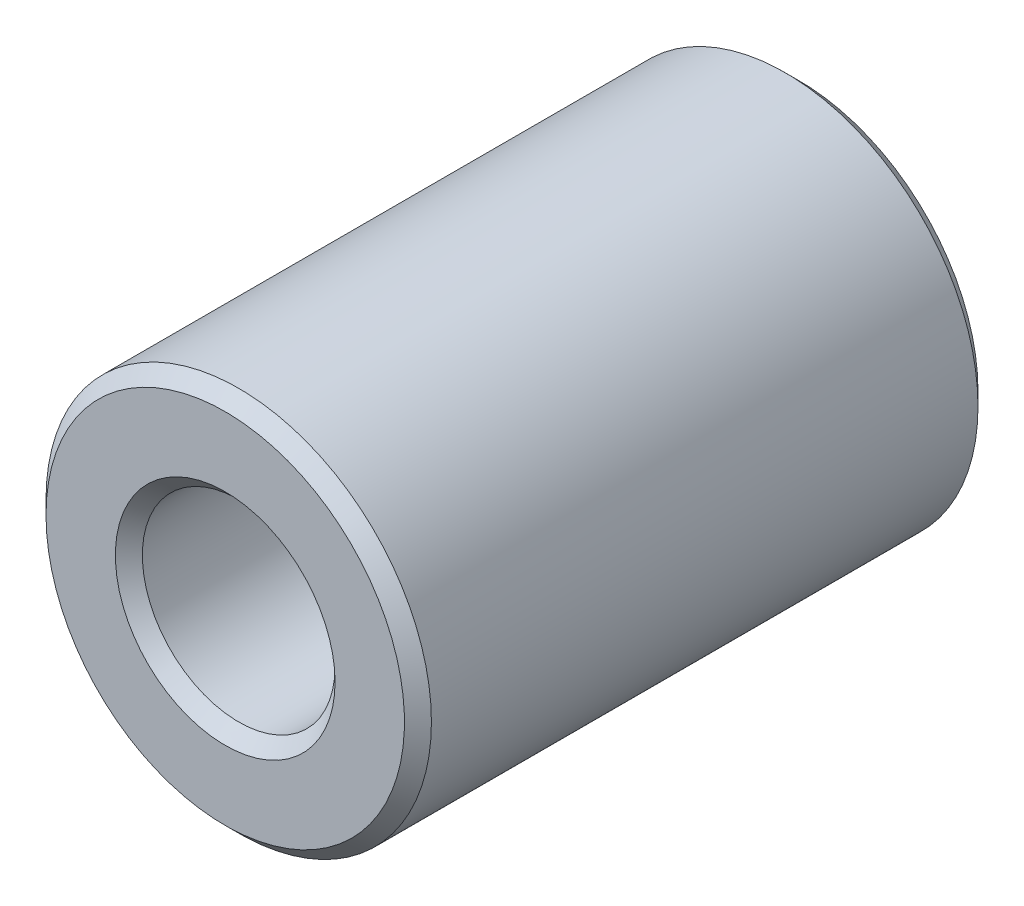
ISO-10303-21;
HEADER;
FILE_DESCRIPTION(('STEP AP214'),'2;1');
FILE_NAME('part.step','',(''),(''),'','','');
FILE_SCHEMA(('AUTOMOTIVE_DESIGN { 1 0 10303 214 1 1 1 1 }'));
ENDSEC;
DATA;
#1=APPLICATION_CONTEXT('core data for automotive mechanical design processes');
#2=APPLICATION_PROTOCOL_DEFINITION('international standard','automotive_design',2000,#1);
#3=PRODUCT_CONTEXT('',#1,'mechanical');
#4=PRODUCT('Part','Part','',(#3));
#5=PRODUCT_RELATED_PRODUCT_CATEGORY('part','',(#4));
#6=PRODUCT_DEFINITION_FORMATION('','',#4);
#7=PRODUCT_DEFINITION_CONTEXT('part definition',#1,'design');
#8=PRODUCT_DEFINITION('design','',#6,#7);
#9=PRODUCT_DEFINITION_SHAPE('','',#8);
#10=(LENGTH_UNIT() NAMED_UNIT(*) SI_UNIT(.MILLI.,.METRE.));
#11=(NAMED_UNIT(*) PLANE_ANGLE_UNIT() SI_UNIT($,.RADIAN.));
#12=(NAMED_UNIT(*) SI_UNIT($,.STERADIAN.) SOLID_ANGLE_UNIT());
#13=UNCERTAINTY_MEASURE_WITH_UNIT(LENGTH_MEASURE(1.E-05),#10,'distance_accuracy_value','');
#14=(GEOMETRIC_REPRESENTATION_CONTEXT(3) GLOBAL_UNCERTAINTY_ASSIGNED_CONTEXT((#13)) GLOBAL_UNIT_ASSIGNED_CONTEXT((#10,
#11,#12)) REPRESENTATION_CONTEXT('',''));
#15=CARTESIAN_POINT('',(0.,0.,0.));
#16=DIRECTION('',(0.,0.,1.));
#17=DIRECTION('',(1.,0.,0.));
#18=AXIS2_PLACEMENT_3D('',#15,#16,#17);
#19=CARTESIAN_POINT('',(0.,0.,-4.7625));
#20=DIRECTION('',(0.,0.,1.));
#21=DIRECTION('',(1.,0.,0.));
#22=AXIS2_PLACEMENT_3D('',#19,#20,#21);
#23=CYLINDRICAL_SURFACE('',#22,3.2004);
#24=CARTESIAN_POINT('',(0.,0.,-4.538472));
#25=DIRECTION('',(0.,0.,1.));
#26=DIRECTION('',(1.,0.,0.));
#27=AXIS2_PLACEMENT_3D('',#24,#25,#26);
#28=CIRCLE('',#27,3.2004);
#29=CARTESIAN_POINT('',(3.2004,0.,-4.538472));
#30=VERTEX_POINT('',#29);
#31=EDGE_CURVE('E76',#30,#30,#28,.T.);
#32=ORIENTED_EDGE('',*,*,#31,.T.);
#33=EDGE_LOOP('',(#32));
#34=FACE_BOUND('',#33,.T.);
#35=CARTESIAN_POINT('',(0.,0.,4.538472));
#36=DIRECTION('',(0.,0.,1.));
#37=DIRECTION('',(1.,0.,0.));
#38=AXIS2_PLACEMENT_3D('',#35,#36,#37);
#39=CIRCLE('',#38,3.2004);
#40=CARTESIAN_POINT('',(-3.2004,0.,4.538472));
#41=VERTEX_POINT('',#40);
#42=EDGE_CURVE('E82',#41,#41,#39,.F.);
#43=ORIENTED_EDGE('',*,*,#42,.T.);
#44=EDGE_LOOP('',(#43));
#45=FACE_BOUND('',#44,.T.);
#46=ADVANCED_FACE('F43',(#34,#45),#23,.T.);
#47=CARTESIAN_POINT('',(0.,0.,-4.7625));
#48=DIRECTION('',(0.,0.,1.));
#49=DIRECTION('',(1.,0.,0.));
#50=AXIS2_PLACEMENT_3D('',#47,#48,#49);
#51=PLANE('',#50);
#52=CARTESIAN_POINT('',(0.,0.,-4.7625));
#53=DIRECTION('',(0.,0.,1.));
#54=DIRECTION('',(1.,0.,0.));
#55=AXIS2_PLACEMENT_3D('',#52,#53,#54);
#56=CIRCLE('',#55,2.976372);
#57=CARTESIAN_POINT('',(2.976372,0.,-4.7625));
#58=VERTEX_POINT('',#57);
#59=EDGE_CURVE('E67',#58,#58,#56,.F.);
#60=ORIENTED_EDGE('',*,*,#59,.T.);
#61=EDGE_LOOP('',(#60));
#62=FACE_BOUND('',#61,.T.);
#63=CARTESIAN_POINT('',(0.,0.,-4.7625));
#64=DIRECTION('',(0.,0.,1.));
#65=DIRECTION('',(1.,0.,0.));
#66=AXIS2_PLACEMENT_3D('',#63,#64,#65);
#67=CIRCLE('',#66,1.824228);
#68=CARTESIAN_POINT('',(1.824228,0.,-4.7625));
#69=VERTEX_POINT('',#68);
#70=EDGE_CURVE('E72',#69,#69,#67,.T.);
#71=ORIENTED_EDGE('',*,*,#70,.T.);
#72=EDGE_LOOP('',(#71));
#73=FACE_BOUND('',#72,.T.);
#74=ADVANCED_FACE('F96',(#62,#73),#51,.F.);
#75=CARTESIAN_POINT('',(0.,0.,-4.7625));
#76=DIRECTION('',(0.,0.,1.));
#77=DIRECTION('',(1.,0.,0.));
#78=AXIS2_PLACEMENT_3D('',#75,#76,#77);
#79=CYLINDRICAL_SURFACE('',#78,1.6002);
#80=CARTESIAN_POINT('',(0.,0.,-4.538472));
#81=DIRECTION('',(0.,0.,1.));
#82=DIRECTION('',(1.,0.,0.));
#83=AXIS2_PLACEMENT_3D('',#80,#81,#82);
#84=CIRCLE('',#83,1.6002);
#85=CARTESIAN_POINT('',(1.6002,0.,-4.538472));
#86=VERTEX_POINT('',#85);
#87=EDGE_CURVE('E59',#86,#86,#84,.F.);
#88=ORIENTED_EDGE('',*,*,#87,.T.);
#89=EDGE_LOOP('',(#88));
#90=FACE_BOUND('',#89,.T.);
#91=CARTESIAN_POINT('',(0.,0.,4.538472));
#92=DIRECTION('',(0.,0.,1.));
#93=DIRECTION('',(1.,0.,0.));
#94=AXIS2_PLACEMENT_3D('',#91,#92,#93);
#95=CIRCLE('',#94,1.6002);
#96=CARTESIAN_POINT('',(1.6002,0.,4.538472));
#97=VERTEX_POINT('',#96);
#98=EDGE_CURVE('E63',#97,#97,#95,.T.);
#99=ORIENTED_EDGE('',*,*,#98,.T.);
#100=EDGE_LOOP('',(#99));
#101=FACE_BOUND('',#100,.T.);
#102=ADVANCED_FACE('F104',(#90,#101),#79,.F.);
#103=CARTESIAN_POINT('',(0.,0.,4.7625));
#104=DIRECTION('',(0.,0.,1.));
#105=DIRECTION('',(1.,0.,0.));
#106=AXIS2_PLACEMENT_3D('',#103,#104,#105);
#107=PLANE('',#106);
#108=CARTESIAN_POINT('',(0.,0.,4.7625));
#109=DIRECTION('',(0.,0.,1.));
#110=DIRECTION('',(1.,0.,0.));
#111=AXIS2_PLACEMENT_3D('',#108,#109,#110);
#112=CIRCLE('',#111,1.824228);
#113=CARTESIAN_POINT('',(1.824228,0.,4.7625));
#114=VERTEX_POINT('',#113);
#115=EDGE_CURVE('E10',#114,#114,#112,.F.);
#116=ORIENTED_EDGE('',*,*,#115,.T.);
#117=EDGE_LOOP('',(#116));
#118=FACE_BOUND('',#117,.T.);
#119=CARTESIAN_POINT('',(0.,0.,4.7625));
#120=DIRECTION('',(0.,0.,1.));
#121=DIRECTION('',(1.,0.,0.));
#122=AXIS2_PLACEMENT_3D('',#119,#120,#121);
#123=CIRCLE('',#122,2.976372);
#124=CARTESIAN_POINT('',(-2.976372,0.,4.7625));
#125=VERTEX_POINT('',#124);
#126=EDGE_CURVE('E55',#125,#125,#123,.T.);
#127=ORIENTED_EDGE('',*,*,#126,.T.);
#128=EDGE_LOOP('',(#127));
#129=FACE_BOUND('',#128,.T.);
#130=ADVANCED_FACE('F116',(#118,#129),#107,.T.);
#131=CARTESIAN_POINT('',(0.,0.,-4.538472));
#132=DIRECTION('',(0.,0.,1.));
#133=DIRECTION('',(1.,0.,0.));
#134=AXIS2_PLACEMENT_3D('',#131,#132,#133);
#135=CONICAL_SURFACE('',#134,3.2004,0.785398163397449);
#136=ORIENTED_EDGE('',*,*,#59,.F.);
#137=EDGE_LOOP('',(#136));
#138=FACE_BOUND('',#137,.T.);
#139=ORIENTED_EDGE('',*,*,#31,.F.);
#140=EDGE_LOOP('',(#139));
#141=FACE_BOUND('',#140,.T.);
#142=ADVANCED_FACE('F109',(#138,#141),#135,.T.);
#143=CARTESIAN_POINT('',(0.,0.,-4.7625));
#144=DIRECTION('',(0.,0.,-1.));
#145=DIRECTION('',(-1.,0.,0.));
#146=AXIS2_PLACEMENT_3D('',#143,#144,#145);
#147=CONICAL_SURFACE('',#146,1.824228,0.785398163397447);
#148=ORIENTED_EDGE('',*,*,#87,.F.);
#149=EDGE_LOOP('',(#148));
#150=FACE_BOUND('',#149,.T.);
#151=ORIENTED_EDGE('',*,*,#70,.F.);
#152=EDGE_LOOP('',(#151));
#153=FACE_BOUND('',#152,.T.);
#154=ADVANCED_FACE('F94',(#150,#153),#147,.F.);
#155=CARTESIAN_POINT('',(0.,0.,4.538472));
#156=DIRECTION('',(0.,0.,1.));
#157=DIRECTION('',(1.,0.,0.));
#158=AXIS2_PLACEMENT_3D('',#155,#156,#157);
#159=CONICAL_SURFACE('',#158,1.6002,0.785398163397447);
#160=CARTESIAN_POINT('',(1.824228,0.,4.7625));
#161=CARTESIAN_POINT('',(1.821894375,0.,4.760166375));
#162=CARTESIAN_POINT('',(1.81956075,0.,4.75783275));
#163=CARTESIAN_POINT('',(1.8148935,0.,4.7531655));
#164=CARTESIAN_POINT('',(1.812559875,0.,4.750831875));
#165=CARTESIAN_POINT('',(1.807892625,0.,4.746164625));
#166=CARTESIAN_POINT('',(1.805559,0.,4.743831));
#167=CARTESIAN_POINT('',(1.80089175,0.,4.73916375));
#168=CARTESIAN_POINT('',(1.798558125,0.,4.736830125));
#169=CARTESIAN_POINT('',(1.793890875,0.,4.732162875));
#170=CARTESIAN_POINT('',(1.79155725,0.,4.72982925));
#171=CARTESIAN_POINT('',(1.78689,0.,4.725162));
#172=CARTESIAN_POINT('',(1.784556375,0.,4.722828375));
#173=CARTESIAN_POINT('',(1.779889125,0.,4.718161125));
#174=CARTESIAN_POINT('',(1.7775555,0.,4.7158275));
#175=CARTESIAN_POINT('',(1.77288825,0.,4.71116025));
#176=CARTESIAN_POINT('',(1.770554625,0.,4.708826625));
#177=CARTESIAN_POINT('',(1.765887375,0.,4.704159375));
#178=CARTESIAN_POINT('',(1.76355375,0.,4.70182575));
#179=CARTESIAN_POINT('',(1.7588865,0.,4.6971585));
#180=CARTESIAN_POINT('',(1.756552875,0.,4.694824875));
#181=CARTESIAN_POINT('',(1.751885625,0.,4.690157625));
#182=CARTESIAN_POINT('',(1.749552,0.,4.687824));
#183=CARTESIAN_POINT('',(1.74488475,0.,4.68315675));
#184=CARTESIAN_POINT('',(1.742551125,0.,4.680823125));
#185=CARTESIAN_POINT('',(1.737883875,0.,4.676155875));
#186=CARTESIAN_POINT('',(1.73555025,0.,4.67382225));
#187=CARTESIAN_POINT('',(1.730883,0.,4.669155));
#188=CARTESIAN_POINT('',(1.728549375,0.,4.666821375));
#189=CARTESIAN_POINT('',(1.723882125,0.,4.662154125));
#190=CARTESIAN_POINT('',(1.7215485,0.,4.6598205));
#191=CARTESIAN_POINT('',(1.71688125,0.,4.65515325));
#192=CARTESIAN_POINT('',(1.714547625,0.,4.652819625));
#193=CARTESIAN_POINT('',(1.709880375,0.,4.648152375));
#194=CARTESIAN_POINT('',(1.70754675,0.,4.64581875));
#195=CARTESIAN_POINT('',(1.7028795,0.,4.6411515));
#196=CARTESIAN_POINT('',(1.700545875,0.,4.638817875));
#197=CARTESIAN_POINT('',(1.695878625,0.,4.634150625));
#198=CARTESIAN_POINT('',(1.693545,0.,4.631817));
#199=CARTESIAN_POINT('',(1.68887775,0.,4.62714975));
#200=CARTESIAN_POINT('',(1.686544125,0.,4.624816125));
#201=CARTESIAN_POINT('',(1.681876875,0.,4.620148875));
#202=CARTESIAN_POINT('',(1.67954325,0.,4.61781525));
#203=CARTESIAN_POINT('',(1.674876,0.,4.613148));
#204=CARTESIAN_POINT('',(1.672542375,0.,4.610814375));
#205=CARTESIAN_POINT('',(1.667875125,0.,4.606147125));
#206=CARTESIAN_POINT('',(1.6655415,0.,4.6038135));
#207=CARTESIAN_POINT('',(1.66087425,0.,4.59914625));
#208=CARTESIAN_POINT('',(1.658540625,0.,4.596812625));
#209=CARTESIAN_POINT('',(1.653873375,0.,4.592145375));
#210=CARTESIAN_POINT('',(1.65153975,0.,4.58981175));
#211=CARTESIAN_POINT('',(1.6468725,0.,4.5851445));
#212=CARTESIAN_POINT('',(1.644538875,0.,4.582810875));
#213=CARTESIAN_POINT('',(1.639871625,0.,4.578143625));
#214=CARTESIAN_POINT('',(1.637538,0.,4.57581));
#215=CARTESIAN_POINT('',(1.63287075,0.,4.57114275));
#216=CARTESIAN_POINT('',(1.630537125,0.,4.568809125));
#217=CARTESIAN_POINT('',(1.625869875,0.,4.564141875));
#218=CARTESIAN_POINT('',(1.62353625,0.,4.56180825));
#219=CARTESIAN_POINT('',(1.618869,0.,4.557141));
#220=CARTESIAN_POINT('',(1.616535375,0.,4.554807375));
#221=CARTESIAN_POINT('',(1.611868125,0.,4.550140125));
#222=CARTESIAN_POINT('',(1.6095345,0.,4.54780649999999));
#223=CARTESIAN_POINT('',(1.60486725,0.,4.54313924999999));
#224=CARTESIAN_POINT('',(1.602533625,0.,4.540805625));
#225=CARTESIAN_POINT('',(1.6002,0.,4.538472));
#226=B_SPLINE_CURVE_WITH_KNOTS('',3,(#160,#161,#162,#163,#164,#165,#166,#167,#168,#169,#170,
#171,#172,#173,#174,#175,#176,#177,#178,#179,#180,#181,#182,#183,#184,#185,#186,#187,#188,#189,
#190,#191,#192,#193,#194,#195,#196,#197,#198,#199,#200,#201,#202,#203,#204,#205,#206,#207,#208,
#209,#210,#211,#212,#213,#214,#215,#216,#217,#218,#219,#220,#221,#222,#223,#224,#225),
.UNSPECIFIED.,.F.,.F.,(4,2,2,2,2,2,2,2,2,2,2,2,2,2,2,2,2,2,2,2,2,2,2,2,2,2,2,2,2,2,2,2,4),(0.,
0.0099007323734791,0.0198014647469582,0.0297021971204367,0.0396029294939159,0.0495036618673944,
0.0594043942408735,0.069305126614352,0.0792058589878311,0.0891065913613102,0.0990073237347887,
0.108908056108268,0.118808788481746,0.128709520855225,0.138610253228704,0.148510985602183,
0.158411717975662,0.168312450349141,0.17821318272262,0.188113915096098,0.198014647469578,
0.207915379843056,0.217816112216535,0.227716844590014,0.237617576963493,0.247518309336972,
0.25741904171045,0.26731977408393,0.277220506457408,0.287121238830887,0.297021971204366,
0.306922703577845,0.316823435951323),.UNSPECIFIED.);
#227=EDGE_CURVE('BSEAM93',#114,#97,#226,.T.);
#228=ORIENTED_EDGE('',*,*,#115,.F.);
#229=ORIENTED_EDGE('',*,*,#98,.F.);
#230=ORIENTED_EDGE('',*,*,#227,.T.);
#231=ORIENTED_EDGE('',*,*,#227,.F.);
#232=EDGE_LOOP('',(#228,#230,#229,#231));
#233=FACE_BOUND('',#232,.T.);
#234=ADVANCED_FACE('F93',(#233),#159,.F.);
#235=CARTESIAN_POINT('',(0.,0.,4.7625));
#236=DIRECTION('',(0.,0.,-1.));
#237=DIRECTION('',(-1.,0.,0.));
#238=AXIS2_PLACEMENT_3D('',#235,#236,#237);
#239=CONICAL_SURFACE('',#238,2.976372,0.785398163397447);
#240=CARTESIAN_POINT('',(-3.2004,0.,4.538472));
#241=CARTESIAN_POINT('',(-3.198066375,0.,4.540805625));
#242=CARTESIAN_POINT('',(-3.19573275,0.,4.54313924999999));
#243=CARTESIAN_POINT('',(-3.1910655,0.,4.54780649999999));
#244=CARTESIAN_POINT('',(-3.188731875,0.,4.550140125));
#245=CARTESIAN_POINT('',(-3.184064625,0.,4.554807375));
#246=CARTESIAN_POINT('',(-3.181731,0.,4.557141));
#247=CARTESIAN_POINT('',(-3.17706375,0.,4.56180825));
#248=CARTESIAN_POINT('',(-3.174730125,0.,4.564141875));
#249=CARTESIAN_POINT('',(-3.170062875,0.,4.568809125));
#250=CARTESIAN_POINT('',(-3.16772925,0.,4.57114275));
#251=CARTESIAN_POINT('',(-3.163062,0.,4.57581));
#252=CARTESIAN_POINT('',(-3.160728375,0.,4.578143625));
#253=CARTESIAN_POINT('',(-3.156061125,0.,4.582810875));
#254=CARTESIAN_POINT('',(-3.1537275,0.,4.5851445));
#255=CARTESIAN_POINT('',(-3.14906025,0.,4.58981175));
#256=CARTESIAN_POINT('',(-3.146726625,0.,4.592145375));
#257=CARTESIAN_POINT('',(-3.142059375,0.,4.596812625));
#258=CARTESIAN_POINT('',(-3.13972575,0.,4.59914625));
#259=CARTESIAN_POINT('',(-3.1350585,0.,4.6038135));
#260=CARTESIAN_POINT('',(-3.132724875,0.,4.606147125));
#261=CARTESIAN_POINT('',(-3.128057625,0.,4.610814375));
#262=CARTESIAN_POINT('',(-3.125724,0.,4.613148));
#263=CARTESIAN_POINT('',(-3.12105675,0.,4.61781525));
#264=CARTESIAN_POINT('',(-3.118723125,0.,4.620148875));
#265=CARTESIAN_POINT('',(-3.114055875,0.,4.624816125));
#266=CARTESIAN_POINT('',(-3.11172225,0.,4.62714975));
#267=CARTESIAN_POINT('',(-3.107055,0.,4.631817));
#268=CARTESIAN_POINT('',(-3.104721375,0.,4.634150625));
#269=CARTESIAN_POINT('',(-3.100054125,0.,4.638817875));
#270=CARTESIAN_POINT('',(-3.0977205,0.,4.6411515));
#271=CARTESIAN_POINT('',(-3.09305325,0.,4.64581875));
#272=CARTESIAN_POINT('',(-3.090719625,0.,4.648152375));
#273=CARTESIAN_POINT('',(-3.086052375,0.,4.652819625));
#274=CARTESIAN_POINT('',(-3.08371875,0.,4.65515325));
#275=CARTESIAN_POINT('',(-3.0790515,0.,4.6598205));
#276=CARTESIAN_POINT('',(-3.076717875,0.,4.662154125));
#277=CARTESIAN_POINT('',(-3.072050625,0.,4.666821375));
#278=CARTESIAN_POINT('',(-3.069717,0.,4.669155));
#279=CARTESIAN_POINT('',(-3.06504975,0.,4.67382225));
#280=CARTESIAN_POINT('',(-3.062716125,0.,4.676155875));
#281=CARTESIAN_POINT('',(-3.058048875,0.,4.680823125));
#282=CARTESIAN_POINT('',(-3.05571525,0.,4.68315675));
#283=CARTESIAN_POINT('',(-3.051048,0.,4.687824));
#284=CARTESIAN_POINT('',(-3.048714375,0.,4.690157625));
#285=CARTESIAN_POINT('',(-3.044047125,0.,4.694824875));
#286=CARTESIAN_POINT('',(-3.0417135,0.,4.6971585));
#287=CARTESIAN_POINT('',(-3.03704625,0.,4.70182575));
#288=CARTESIAN_POINT('',(-3.034712625,0.,4.704159375));
#289=CARTESIAN_POINT('',(-3.030045375,0.,4.708826625));
#290=CARTESIAN_POINT('',(-3.02771175,0.,4.71116025));
#291=CARTESIAN_POINT('',(-3.0230445,0.,4.7158275));
#292=CARTESIAN_POINT('',(-3.020710875,0.,4.718161125));
#293=CARTESIAN_POINT('',(-3.016043625,0.,4.722828375));
#294=CARTESIAN_POINT('',(-3.01371,0.,4.725162));
#295=CARTESIAN_POINT('',(-3.00904275,0.,4.72982925));
#296=CARTESIAN_POINT('',(-3.006709125,0.,4.732162875));
#297=CARTESIAN_POINT('',(-3.002041875,0.,4.736830125));
#298=CARTESIAN_POINT('',(-2.99970825,0.,4.73916375));
#299=CARTESIAN_POINT('',(-2.995041,0.,4.743831));
#300=CARTESIAN_POINT('',(-2.992707375,0.,4.746164625));
#301=CARTESIAN_POINT('',(-2.988040125,0.,4.750831875));
#302=CARTESIAN_POINT('',(-2.9857065,0.,4.7531655));
#303=CARTESIAN_POINT('',(-2.98103925,0.,4.75783275));
#304=CARTESIAN_POINT('',(-2.978705625,0.,4.760166375));
#305=CARTESIAN_POINT('',(-2.976372,0.,4.7625));
#306=B_SPLINE_CURVE_WITH_KNOTS('',3,(#240,#241,#242,#243,#244,#245,#246,#247,#248,#249,#250,
#251,#252,#253,#254,#255,#256,#257,#258,#259,#260,#261,#262,#263,#264,#265,#266,#267,#268,#269,
#270,#271,#272,#273,#274,#275,#276,#277,#278,#279,#280,#281,#282,#283,#284,#285,#286,#287,#288,
#289,#290,#291,#292,#293,#294,#295,#296,#297,#298,#299,#300,#301,#302,#303,#304,#305),
.UNSPECIFIED.,.F.,.F.,(4,2,2,2,2,2,2,2,2,2,2,2,2,2,2,2,2,2,2,2,2,2,2,2,2,2,2,2,2,2,2,2,4),(0.,
0.00990073237347848,0.0198014647469576,0.0297021971204361,0.0396029294939152,0.0495036618673936,
0.059404394240873,0.0693051266143515,0.0792058589878306,0.0891065913613097,0.0990073237347882,
0.108908056108267,0.118808788481746,0.128709520855225,0.138610253228703,0.148510985602182,
0.158411717975662,0.16831245034914,0.178213182722619,0.188113915096098,0.198014647469577,
0.207915379843056,0.217816112216535,0.227716844590013,0.237617576963492,0.247518309336971,
0.25741904171045,0.267319774083929,0.277220506457408,0.287121238830887,0.297021971204365,
0.306922703577844,0.316823435951324),.UNSPECIFIED.);
#307=EDGE_CURVE('BSEAM46',#41,#125,#306,.T.);
#308=ORIENTED_EDGE('',*,*,#42,.F.);
#309=ORIENTED_EDGE('',*,*,#126,.F.);
#310=ORIENTED_EDGE('',*,*,#307,.T.);
#311=ORIENTED_EDGE('',*,*,#307,.F.);
#312=EDGE_LOOP('',(#308,#310,#309,#311));
#313=FACE_BOUND('',#312,.T.);
#314=ADVANCED_FACE('F46',(#313),#239,.T.);
#315=CLOSED_SHELL('',(#46,#74,#102,#130,#142,#154,#234,#314));
#316=MANIFOLD_SOLID_BREP('B2',#315);
#317=ADVANCED_BREP_SHAPE_REPRESENTATION('',(#18,#316),#14);
#318=SHAPE_DEFINITION_REPRESENTATION(#9,#317);
ENDSEC;
END-ISO-10303-21;
